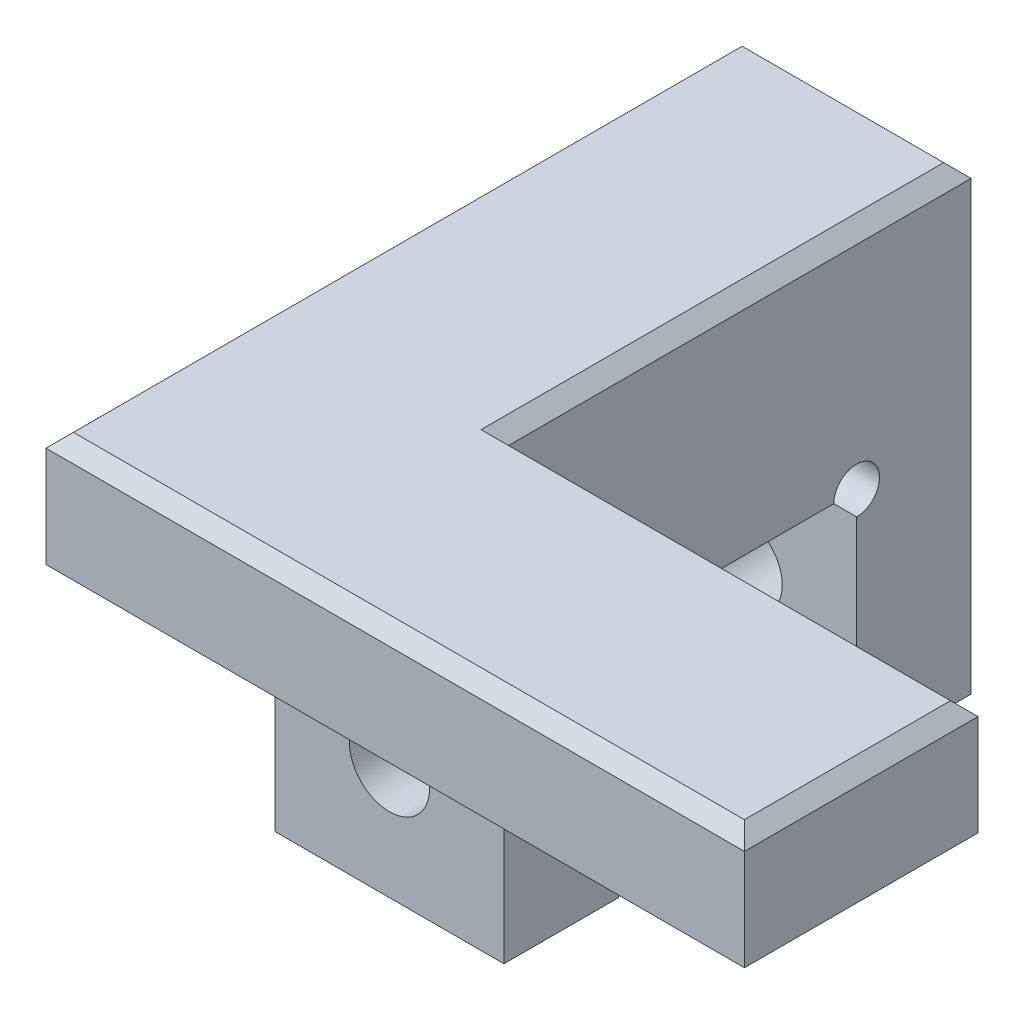
ISO-10303-21;
HEADER;
FILE_DESCRIPTION(('STEP AP214'),'2;1');
FILE_NAME('part.step','',(''),(''),'','','');
FILE_SCHEMA(('AUTOMOTIVE_DESIGN { 1 0 10303 214 1 1 1 1 }'));
ENDSEC;
DATA;
#1=APPLICATION_CONTEXT('core data for automotive mechanical design processes');
#2=APPLICATION_PROTOCOL_DEFINITION('international standard','automotive_design',2000,#1);
#3=PRODUCT_CONTEXT('',#1,'mechanical');
#4=PRODUCT('Part','Part','',(#3));
#5=PRODUCT_RELATED_PRODUCT_CATEGORY('part','',(#4));
#6=PRODUCT_DEFINITION_FORMATION('','',#4);
#7=PRODUCT_DEFINITION_CONTEXT('part definition',#1,'design');
#8=PRODUCT_DEFINITION('design','',#6,#7);
#9=PRODUCT_DEFINITION_SHAPE('','',#8);
#10=(LENGTH_UNIT() NAMED_UNIT(*) SI_UNIT(.MILLI.,.METRE.));
#11=(NAMED_UNIT(*) PLANE_ANGLE_UNIT() SI_UNIT($,.RADIAN.));
#12=(NAMED_UNIT(*) SI_UNIT($,.STERADIAN.) SOLID_ANGLE_UNIT());
#13=UNCERTAINTY_MEASURE_WITH_UNIT(LENGTH_MEASURE(1.E-05),#10,'distance_accuracy_value','');
#14=(GEOMETRIC_REPRESENTATION_CONTEXT(3) GLOBAL_UNCERTAINTY_ASSIGNED_CONTEXT((#13)) GLOBAL_UNIT_ASSIGNED_CONTEXT((#10,
#11,#12)) REPRESENTATION_CONTEXT('',''));
#15=CARTESIAN_POINT('',(0.,0.,0.));
#16=DIRECTION('',(0.,0.,1.));
#17=DIRECTION('',(1.,0.,0.));
#18=AXIS2_PLACEMENT_3D('',#15,#16,#17);
#19=CARTESIAN_POINT('',(10.,0.,5.2));
#20=DIRECTION('',(0.,0.,1.));
#21=DIRECTION('',(1.,0.,0.));
#22=AXIS2_PLACEMENT_3D('',#19,#20,#21);
#23=PLANE('',#22);
#24=CARTESIAN_POINT('',(15.,-0.0999999999999989,5.2));
#25=DIRECTION('',(0.,0.,1.));
#26=DIRECTION('',(1.,0.,0.));
#27=AXIS2_PLACEMENT_3D('',#24,#25,#26);
#28=CIRCLE('',#27,1.75);
#29=CARTESIAN_POINT('',(16.75,-0.0999999999999989,5.2));
#30=VERTEX_POINT('',#29);
#31=EDGE_CURVE('E325',#30,#30,#28,.F.);
#32=ORIENTED_EDGE('',*,*,#31,.F.);
#33=EDGE_LOOP('',(#32));
#34=FACE_BOUND('',#33,.T.);
#35=DIRECTION('',(-1.,0.,0.));
#36=VECTOR('',#35,1.);
#37=CARTESIAN_POINT('',(10.,-5.1,5.2));
#38=LINE('',#37,#36);
#39=CARTESIAN_POINT('',(20.,-5.1,5.2));
#40=VERTEX_POINT('',#39);
#41=CARTESIAN_POINT('',(10.,-5.1,5.2));
#42=VERTEX_POINT('',#41);
#43=EDGE_CURVE('E214',#40,#42,#38,.T.);
#44=ORIENTED_EDGE('',*,*,#43,.T.);
#45=DIRECTION('',(0.,1.,0.));
#46=VECTOR('',#45,1.);
#47=CARTESIAN_POINT('',(10.,0.,5.2));
#48=LINE('',#47,#46);
#49=CARTESIAN_POINT('',(10.,4.1,5.2));
#50=VERTEX_POINT('',#49);
#51=EDGE_CURVE('E387',#42,#50,#48,.T.);
#52=ORIENTED_EDGE('',*,*,#51,.T.);
#53=DIRECTION('',(-1.,0.,0.));
#54=VECTOR('',#53,1.);
#55=CARTESIAN_POINT('',(10.,4.1,5.2));
#56=LINE('',#55,#54);
#57=CARTESIAN_POINT('',(20.,4.1,5.2));
#58=VERTEX_POINT('',#57);
#59=EDGE_CURVE('E197',#50,#58,#56,.F.);
#60=ORIENTED_EDGE('',*,*,#59,.T.);
#61=DIRECTION('',(0.,1.,0.));
#62=VECTOR('',#61,1.);
#63=CARTESIAN_POINT('',(20.,0.,5.2));
#64=LINE('',#63,#62);
#65=EDGE_CURVE('E355',#40,#58,#64,.T.);
#66=ORIENTED_EDGE('',*,*,#65,.F.);
#67=EDGE_LOOP('',(#44,#52,#60,#66));
#68=FACE_BOUND('',#67,.T.);
#69=ADVANCED_FACE('F45',(#34,#68),#23,.F.);
#70=CARTESIAN_POINT('',(10.,5.1,0.));
#71=DIRECTION('',(0.,1.,0.));
#72=DIRECTION('',(0.,0.,1.));
#73=AXIS2_PLACEMENT_3D('',#70,#71,#72);
#74=PLANE('',#73);
#75=DIRECTION('',(-1.,0.,0.));
#76=VECTOR('',#75,1.);
#77=CARTESIAN_POINT('',(10.,5.1,4.2));
#78=LINE('',#77,#76);
#79=CARTESIAN_POINT('',(20.,5.1,4.2));
#80=VERTEX_POINT('',#79);
#81=CARTESIAN_POINT('',(10.,5.1,4.2));
#82=VERTEX_POINT('',#81);
#83=EDGE_CURVE('E203',#80,#82,#78,.T.);
#84=ORIENTED_EDGE('',*,*,#83,.T.);
#85=DIRECTION('',(0.,0.,-1.));
#86=VECTOR('',#85,1.);
#87=CARTESIAN_POINT('',(10.,5.1,0.));
#88=LINE('',#87,#86);
#89=CARTESIAN_POINT('',(10.,5.1,-4.2));
#90=VERTEX_POINT('',#89);
#91=EDGE_CURVE('E374',#82,#90,#88,.T.);
#92=ORIENTED_EDGE('',*,*,#91,.T.);
#93=DIRECTION('',(-1.,0.,0.));
#94=VECTOR('',#93,1.);
#95=CARTESIAN_POINT('',(10.,5.1,-4.2));
#96=LINE('',#95,#94);
#97=CARTESIAN_POINT('',(20.,5.1,-4.2));
#98=VERTEX_POINT('',#97);
#99=EDGE_CURVE('E366',#90,#98,#96,.F.);
#100=ORIENTED_EDGE('',*,*,#99,.T.);
#101=DIRECTION('',(0.,0.,-1.));
#102=VECTOR('',#101,1.);
#103=CARTESIAN_POINT('',(20.,5.1,0.));
#104=LINE('',#103,#102);
#105=EDGE_CURVE('E352',#80,#98,#104,.T.);
#106=ORIENTED_EDGE('',*,*,#105,.F.);
#107=EDGE_LOOP('',(#84,#92,#100,#106));
#108=FACE_BOUND('',#107,.T.);
#109=ADVANCED_FACE('F373',(#108),#74,.F.);
#110=CARTESIAN_POINT('',(10.,0.,-5.2));
#111=DIRECTION('',(0.,0.,1.));
#112=DIRECTION('',(1.,0.,0.));
#113=AXIS2_PLACEMENT_3D('',#110,#111,#112);
#114=PLANE('',#113);
#115=DIRECTION('',(0.,1.,0.));
#116=VECTOR('',#115,1.);
#117=CARTESIAN_POINT('',(10.,0.,-5.2));
#118=LINE('',#117,#116);
#119=CARTESIAN_POINT('',(10.,-5.1,-5.19999999999999));
#120=VERTEX_POINT('',#119);
#121=CARTESIAN_POINT('',(10.,4.1,-5.2));
#122=VERTEX_POINT('',#121);
#123=EDGE_CURVE('E178',#120,#122,#118,.T.);
#124=ORIENTED_EDGE('',*,*,#123,.F.);
#125=DIRECTION('',(-1.,0.,0.));
#126=VECTOR('',#125,1.);
#127=CARTESIAN_POINT('',(10.,-5.1,-5.2));
#128=LINE('',#127,#126);
#129=CARTESIAN_POINT('',(20.,-5.1,-5.2));
#130=VERTEX_POINT('',#129);
#131=EDGE_CURVE('E210',#130,#120,#128,.T.);
#132=ORIENTED_EDGE('',*,*,#131,.F.);
#133=DIRECTION('',(0.,1.,0.));
#134=VECTOR('',#133,1.);
#135=CARTESIAN_POINT('',(20.,0.,-5.2));
#136=LINE('',#135,#134);
#137=CARTESIAN_POINT('',(20.,4.1,-5.2));
#138=VERTEX_POINT('',#137);
#139=EDGE_CURVE('E349',#130,#138,#136,.T.);
#140=ORIENTED_EDGE('',*,*,#139,.T.);
#141=DIRECTION('',(-1.,0.,0.));
#142=VECTOR('',#141,1.);
#143=CARTESIAN_POINT('',(10.,4.1,-5.2));
#144=LINE('',#143,#142);
#145=EDGE_CURVE('E363',#122,#138,#144,.F.);
#146=ORIENTED_EDGE('',*,*,#145,.F.);
#147=EDGE_LOOP('',(#124,#132,#140,#146));
#148=FACE_BOUND('',#147,.T.);
#149=CARTESIAN_POINT('',(15.,-0.0999999999999989,-5.2));
#150=DIRECTION('',(0.,0.,1.));
#151=DIRECTION('',(1.,0.,0.));
#152=AXIS2_PLACEMENT_3D('',#149,#150,#151);
#153=CIRCLE('',#152,1.75);
#154=CARTESIAN_POINT('',(16.75,-0.0999999999999989,-5.2));
#155=VERTEX_POINT('',#154);
#156=EDGE_CURVE('E321',#155,#155,#153,.F.);
#157=ORIENTED_EDGE('',*,*,#156,.T.);
#158=EDGE_LOOP('',(#157));
#159=FACE_BOUND('',#158,.T.);
#160=ADVANCED_FACE('F407',(#148,#159),#114,.T.);
#161=CARTESIAN_POINT('',(10.,0.,10.2));
#162=DIRECTION('',(0.,0.,-1.));
#163=DIRECTION('',(0.,1.,0.));
#164=AXIS2_PLACEMENT_3D('',#161,#162,#163);
#165=PLANE('',#164);
#166=CARTESIAN_POINT('',(15.,-0.0999999999999989,10.2));
#167=DIRECTION('',(0.,0.,-1.));
#168=DIRECTION('',(0.,1.,0.));
#169=AXIS2_PLACEMENT_3D('',#166,#167,#168);
#170=CIRCLE('',#169,1.75);
#171=CARTESIAN_POINT('',(15.,1.65,10.2));
#172=VERTEX_POINT('',#171);
#173=EDGE_CURVE('E329',#172,#172,#170,.F.);
#174=ORIENTED_EDGE('',*,*,#173,.F.);
#175=EDGE_LOOP('',(#174));
#176=FACE_BOUND('',#175,.T.);
#177=DIRECTION('',(-1.,0.,0.));
#178=VECTOR('',#177,1.);
#179=CARTESIAN_POINT('',(10.,10.,10.2));
#180=LINE('',#179,#178);
#181=CARTESIAN_POINT('',(20.,10.,10.2));
#182=VERTEX_POINT('',#181);
#183=CARTESIAN_POINT('',(10.,10.,10.2));
#184=VERTEX_POINT('',#183);
#185=EDGE_CURVE('E196',#182,#184,#180,.T.);
#186=ORIENTED_EDGE('',*,*,#185,.T.);
#187=DIRECTION('',(0.,-1.,0.));
#188=VECTOR('',#187,1.);
#189=CARTESIAN_POINT('',(10.,0.,10.2));
#190=LINE('',#189,#188);
#191=CARTESIAN_POINT('',(10.,-5.1,10.2));
#192=VERTEX_POINT('',#191);
#193=EDGE_CURVE('E173',#184,#192,#190,.T.);
#194=ORIENTED_EDGE('',*,*,#193,.T.);
#195=DIRECTION('',(-1.,0.,0.));
#196=VECTOR('',#195,1.);
#197=CARTESIAN_POINT('',(10.,-5.1,10.2));
#198=LINE('',#197,#196);
#199=CARTESIAN_POINT('',(20.,-5.1,10.2));
#200=VERTEX_POINT('',#199);
#201=EDGE_CURVE('E218',#200,#192,#198,.T.);
#202=ORIENTED_EDGE('',*,*,#201,.F.);
#203=DIRECTION('',(0.,-1.,0.));
#204=VECTOR('',#203,1.);
#205=CARTESIAN_POINT('',(20.,0.,10.2));
#206=LINE('',#205,#204);
#207=EDGE_CURVE('E333',#182,#200,#206,.T.);
#208=ORIENTED_EDGE('',*,*,#207,.F.);
#209=EDGE_LOOP('',(#186,#194,#202,#208));
#210=FACE_BOUND('',#209,.T.);
#211=ADVANCED_FACE('F448',(#176,#210),#165,.F.);
#212=CARTESIAN_POINT('',(10.,-5.1,0.));
#213=DIRECTION('',(0.,1.,0.));
#214=DIRECTION('',(0.,0.,1.));
#215=AXIS2_PLACEMENT_3D('',#212,#213,#214);
#216=PLANE('',#215);
#217=ORIENTED_EDGE('',*,*,#201,.T.);
#218=DIRECTION('',(0.,0.,-1.));
#219=VECTOR('',#218,1.);
#220=CARTESIAN_POINT('',(10.,-5.1,20.2));
#221=LINE('',#220,#219);
#222=EDGE_CURVE('E187',#192,#42,#221,.T.);
#223=ORIENTED_EDGE('',*,*,#222,.T.);
#224=ORIENTED_EDGE('',*,*,#43,.F.);
#225=DIRECTION('',(0.,0.,-1.));
#226=VECTOR('',#225,1.);
#227=CARTESIAN_POINT('',(20.,-5.1,0.));
#228=LINE('',#227,#226);
#229=EDGE_CURVE('E359',#200,#40,#228,.T.);
#230=ORIENTED_EDGE('',*,*,#229,.F.);
#231=EDGE_LOOP('',(#217,#223,#224,#230));
#232=FACE_BOUND('',#231,.T.);
#233=ADVANCED_FACE('F446',(#232),#216,.F.);
#234=CARTESIAN_POINT('',(10.,-5.1,0.));
#235=DIRECTION('',(0.,1.,0.));
#236=DIRECTION('',(0.,0.,1.));
#237=AXIS2_PLACEMENT_3D('',#234,#235,#236);
#238=PLANE('',#237);
#239=ORIENTED_EDGE('',*,*,#131,.T.);
#240=CARTESIAN_POINT('',(10.,-5.1,-10.2));
#241=VERTEX_POINT('',#240);
#242=EDGE_CURVE('E402',#120,#241,#221,.T.);
#243=ORIENTED_EDGE('',*,*,#242,.T.);
#244=DIRECTION('',(-1.,0.,0.));
#245=VECTOR('',#244,1.);
#246=CARTESIAN_POINT('',(10.,-5.1,-10.2));
#247=LINE('',#246,#245);
#248=CARTESIAN_POINT('',(20.,-5.1,-10.2));
#249=VERTEX_POINT('',#248);
#250=EDGE_CURVE('E201',#249,#241,#247,.T.);
#251=ORIENTED_EDGE('',*,*,#250,.F.);
#252=DIRECTION('',(0.,0.,-1.));
#253=VECTOR('',#252,1.);
#254=CARTESIAN_POINT('',(20.,-5.1,0.));
#255=LINE('',#254,#253);
#256=EDGE_CURVE('E345',#130,#249,#255,.T.);
#257=ORIENTED_EDGE('',*,*,#256,.F.);
#258=EDGE_LOOP('',(#239,#243,#251,#257));
#259=FACE_BOUND('',#258,.T.);
#260=ADVANCED_FACE('F411',(#259),#238,.F.);
#261=CARTESIAN_POINT('',(10.,0.,-10.2));
#262=DIRECTION('',(0.,0.,1.));
#263=DIRECTION('',(1.,0.,0.));
#264=AXIS2_PLACEMENT_3D('',#261,#262,#263);
#265=PLANE('',#264);
#266=ORIENTED_EDGE('',*,*,#250,.T.);
#267=DIRECTION('',(0.,1.,0.));
#268=VECTOR('',#267,1.);
#269=CARTESIAN_POINT('',(10.,0.,-10.2));
#270=LINE('',#269,#268);
#271=CARTESIAN_POINT('',(10.,14.4,-10.2));
#272=VERTEX_POINT('',#271);
#273=EDGE_CURVE('E186',#241,#272,#270,.T.);
#274=ORIENTED_EDGE('',*,*,#273,.T.);
#275=DIRECTION('',(1.,0.,0.));
#276=VECTOR('',#275,1.);
#277=CARTESIAN_POINT('',(10.,14.4,-10.2));
#278=LINE('',#277,#276);
#279=CARTESIAN_POINT('',(20.,14.4,-10.2));
#280=VERTEX_POINT('',#279);
#281=EDGE_CURVE('E230',#272,#280,#278,.T.);
#282=ORIENTED_EDGE('',*,*,#281,.T.);
#283=DIRECTION('',(0.,1.,0.));
#284=VECTOR('',#283,1.);
#285=CARTESIAN_POINT('',(20.,0.,-10.2));
#286=LINE('',#285,#284);
#287=EDGE_CURVE('E341',#249,#280,#286,.T.);
#288=ORIENTED_EDGE('',*,*,#287,.F.);
#289=EDGE_LOOP('',(#266,#274,#282,#288));
#290=FACE_BOUND('',#289,.T.);
#291=CARTESIAN_POINT('',(15.,-0.0999999999999989,-10.2));
#292=DIRECTION('',(0.,0.,-1.));
#293=DIRECTION('',(-1.,0.,0.));
#294=AXIS2_PLACEMENT_3D('',#291,#292,#293);
#295=CIRCLE('',#294,1.75);
#296=CARTESIAN_POINT('',(13.25,-0.0999999999999989,-10.2));
#297=VERTEX_POINT('',#296);
#298=EDGE_CURVE('E317',#297,#297,#295,.T.);
#299=ORIENTED_EDGE('',*,*,#298,.F.);
#300=EDGE_LOOP('',(#299));
#301=FACE_BOUND('',#300,.T.);
#302=ADVANCED_FACE('F415',(#290,#301),#265,.F.);
#303=CARTESIAN_POINT('',(10.,15.,20.2));
#304=DIRECTION('',(0.,0.,-1.));
#305=DIRECTION('',(0.,1.,0.));
#306=AXIS2_PLACEMENT_3D('',#303,#304,#305);
#307=PLANE('',#306);
#308=DIRECTION('',(-1.,0.,0.));
#309=VECTOR('',#308,1.);
#310=CARTESIAN_POINT('',(10.,14.4,20.2));
#311=LINE('',#310,#309);
#312=CARTESIAN_POINT('',(40.5,14.4,20.2));
#313=VERTEX_POINT('',#312);
#314=CARTESIAN_POINT('',(10.,14.4,20.2));
#315=VERTEX_POINT('',#314);
#316=EDGE_CURVE('E11',#313,#315,#311,.T.);
#317=ORIENTED_EDGE('',*,*,#316,.T.);
#318=DIRECTION('',(0.,1.,0.));
#319=VECTOR('',#318,1.);
#320=CARTESIAN_POINT('',(10.,-5.1,20.2));
#321=LINE('',#320,#319);
#322=CARTESIAN_POINT('',(10.,9.99999999999999,20.2));
#323=VERTEX_POINT('',#322);
#324=EDGE_CURVE('E171',#323,#315,#321,.T.);
#325=ORIENTED_EDGE('',*,*,#324,.F.);
#326=DIRECTION('',(1.,0.,0.));
#327=VECTOR('',#326,1.);
#328=CARTESIAN_POINT('',(10.,9.99999999999999,20.2));
#329=LINE('',#328,#327);
#330=CARTESIAN_POINT('',(40.5,9.99999999999999,20.2));
#331=VERTEX_POINT('',#330);
#332=EDGE_CURVE('E182',#323,#331,#329,.T.);
#333=ORIENTED_EDGE('',*,*,#332,.T.);
#334=DIRECTION('',(0.,-1.,0.));
#335=VECTOR('',#334,1.);
#336=CARTESIAN_POINT('',(40.5,15.,20.2));
#337=LINE('',#336,#335);
#338=EDGE_CURVE('E314',#313,#331,#337,.T.);
#339=ORIENTED_EDGE('',*,*,#338,.F.);
#340=EDGE_LOOP('',(#317,#325,#333,#339));
#341=FACE_BOUND('',#340,.T.);
#342=ADVANCED_FACE('F181',(#341),#307,.F.);
#343=CARTESIAN_POINT('',(0.,10.,0.));
#344=DIRECTION('',(0.,-1.,0.));
#345=DIRECTION('',(0.,0.,-1.));
#346=AXIS2_PLACEMENT_3D('',#343,#344,#345);
#347=PLANE('',#346);
#348=DIRECTION('',(0.,0.,1.));
#349=VECTOR('',#348,1.);
#350=CARTESIAN_POINT('',(10.,10.,0.));
#351=LINE('',#350,#349);
#352=EDGE_CURVE('E168',#184,#323,#351,.T.);
#353=ORIENTED_EDGE('',*,*,#352,.F.);
#354=ORIENTED_EDGE('',*,*,#185,.F.);
#355=DIRECTION('',(0.,0.,1.));
#356=VECTOR('',#355,1.);
#357=CARTESIAN_POINT('',(20.,10.,0.));
#358=LINE('',#357,#356);
#359=CARTESIAN_POINT('',(20.,10.,10.));
#360=VERTEX_POINT('',#359);
#361=EDGE_CURVE('E337',#360,#182,#358,.T.);
#362=ORIENTED_EDGE('',*,*,#361,.F.);
#363=DIRECTION('',(1.,0.,0.));
#364=VECTOR('',#363,1.);
#365=CARTESIAN_POINT('',(40.5,10.,10.));
#366=LINE('',#365,#364);
#367=CARTESIAN_POINT('',(40.5,10.,10.));
#368=VERTEX_POINT('',#367);
#369=EDGE_CURVE('E305',#360,#368,#366,.T.);
#370=ORIENTED_EDGE('',*,*,#369,.T.);
#371=DIRECTION('',(0.,0.,1.));
#372=VECTOR('',#371,1.);
#373=CARTESIAN_POINT('',(40.5,9.99999999999999,20.2));
#374=LINE('',#373,#372);
#375=EDGE_CURVE('E194',#368,#331,#374,.T.);
#376=ORIENTED_EDGE('',*,*,#375,.T.);
#377=ORIENTED_EDGE('',*,*,#332,.F.);
#378=EDGE_LOOP('',(#353,#354,#362,#370,#376,#377));
#379=FACE_BOUND('',#378,.T.);
#380=CARTESIAN_POINT('',(30.25,10.,15.1));
#381=DIRECTION('',(0.,1.,0.));
#382=DIRECTION('',(0.,0.,-1.));
#383=AXIS2_PLACEMENT_3D('',#380,#381,#382);
#384=CIRCLE('',#383,3.2);
#385=CARTESIAN_POINT('',(30.25,10.,11.9));
#386=VERTEX_POINT('',#385);
#387=EDGE_CURVE('E287',#386,#386,#384,.T.);
#388=ORIENTED_EDGE('',*,*,#387,.T.);
#389=EDGE_LOOP('',(#388));
#390=FACE_BOUND('',#389,.T.);
#391=ADVANCED_FACE('F190',(#379,#390),#347,.T.);
#392=CARTESIAN_POINT('',(10.,5.1,-5.2));
#393=DIRECTION('',(-1.,0.,0.));
#394=DIRECTION('',(0.,0.,1.));
#395=AXIS2_PLACEMENT_3D('',#392,#393,#394);
#396=CYLINDRICAL_SURFACE('',#395,1.);
#397=ORIENTED_EDGE('',*,*,#99,.F.);
#398=CARTESIAN_POINT('',(10.,5.1,-5.2));
#399=DIRECTION('',(1.,0.,0.));
#400=DIRECTION('',(0.,1.,0.));
#401=AXIS2_PLACEMENT_3D('',#398,#399,#400);
#402=CIRCLE('',#401,1.);
#403=EDGE_CURVE('E390',#90,#122,#402,.F.);
#404=ORIENTED_EDGE('',*,*,#403,.T.);
#405=ORIENTED_EDGE('',*,*,#145,.T.);
#406=CARTESIAN_POINT('',(20.,5.1,-5.2));
#407=DIRECTION('',(-1.,0.,0.));
#408=DIRECTION('',(0.,0.,1.));
#409=AXIS2_PLACEMENT_3D('',#406,#407,#408);
#410=CIRCLE('',#409,1.);
#411=EDGE_CURVE('E281',#98,#138,#410,.T.);
#412=ORIENTED_EDGE('',*,*,#411,.F.);
#413=EDGE_LOOP('',(#397,#404,#405,#412));
#414=FACE_BOUND('',#413,.T.);
#415=ADVANCED_FACE('F406',(#414),#396,.F.);
#416=CARTESIAN_POINT('',(10.,5.1,5.2));
#417=DIRECTION('',(-1.,0.,0.));
#418=DIRECTION('',(0.,0.,1.));
#419=AXIS2_PLACEMENT_3D('',#416,#417,#418);
#420=CYLINDRICAL_SURFACE('',#419,1.);
#421=ORIENTED_EDGE('',*,*,#59,.F.);
#422=CARTESIAN_POINT('',(10.,5.1,5.2));
#423=DIRECTION('',(1.,0.,0.));
#424=DIRECTION('',(0.,1.,0.));
#425=AXIS2_PLACEMENT_3D('',#422,#423,#424);
#426=CIRCLE('',#425,1.);
#427=EDGE_CURVE('E381',#50,#82,#426,.F.);
#428=ORIENTED_EDGE('',*,*,#427,.T.);
#429=ORIENTED_EDGE('',*,*,#83,.F.);
#430=CARTESIAN_POINT('',(20.,5.1,5.2));
#431=DIRECTION('',(-1.,0.,0.));
#432=DIRECTION('',(0.,0.,1.));
#433=AXIS2_PLACEMENT_3D('',#430,#431,#432);
#434=CIRCLE('',#433,1.);
#435=EDGE_CURVE('E226',#80,#58,#434,.F.);
#436=ORIENTED_EDGE('',*,*,#435,.T.);
#437=EDGE_LOOP('',(#421,#428,#429,#436));
#438=FACE_BOUND('',#437,.T.);
#439=ADVANCED_FACE('F380',(#438),#420,.F.);
#440=CARTESIAN_POINT('',(20.,0.,0.));
#441=DIRECTION('',(-1.,0.,0.));
#442=DIRECTION('',(0.,0.,-1.));
#443=AXIS2_PLACEMENT_3D('',#440,#441,#442);
#444=PLANE('',#443);
#445=ORIENTED_EDGE('',*,*,#287,.T.);
#446=DIRECTION('',(0.,0.,1.));
#447=VECTOR('',#446,1.);
#448=CARTESIAN_POINT('',(20.,14.4,0.));
#449=LINE('',#448,#447);
#450=CARTESIAN_POINT('',(20.,14.4,10.));
#451=VERTEX_POINT('',#450);
#452=EDGE_CURVE('E253',#280,#451,#449,.T.);
#453=ORIENTED_EDGE('',*,*,#452,.T.);
#454=DIRECTION('',(0.,-1.,0.));
#455=VECTOR('',#454,1.);
#456=CARTESIAN_POINT('',(20.,15.,10.));
#457=LINE('',#456,#455);
#458=EDGE_CURVE('E308',#451,#360,#457,.T.);
#459=ORIENTED_EDGE('',*,*,#458,.T.);
#460=ORIENTED_EDGE('',*,*,#361,.T.);
#461=ORIENTED_EDGE('',*,*,#207,.T.);
#462=ORIENTED_EDGE('',*,*,#229,.T.);
#463=ORIENTED_EDGE('',*,*,#65,.T.);
#464=ORIENTED_EDGE('',*,*,#435,.F.);
#465=ORIENTED_EDGE('',*,*,#105,.T.);
#466=ORIENTED_EDGE('',*,*,#411,.T.);
#467=ORIENTED_EDGE('',*,*,#139,.F.);
#468=ORIENTED_EDGE('',*,*,#256,.T.);
#469=EDGE_LOOP('',(#445,#453,#459,#460,#461,#462,#463,#464,#465,#466,#467,#468));
#470=FACE_BOUND('',#469,.T.);
#471=ADVANCED_FACE('F382',(#470),#444,.F.);
#472=CARTESIAN_POINT('',(15.,-0.0999999999999989,-10.2));
#473=DIRECTION('',(0.,0.,1.));
#474=DIRECTION('',(1.,0.,0.));
#475=AXIS2_PLACEMENT_3D('',#472,#473,#474);
#476=CYLINDRICAL_SURFACE('',#475,1.75);
#477=ORIENTED_EDGE('',*,*,#156,.F.);
#478=EDGE_LOOP('',(#477));
#479=FACE_BOUND('',#478,.T.);
#480=ORIENTED_EDGE('',*,*,#298,.T.);
#481=EDGE_LOOP('',(#480));
#482=FACE_BOUND('',#481,.T.);
#483=ADVANCED_FACE('F485',(#479,#482),#476,.F.);
#484=ORIENTED_EDGE('',*,*,#31,.T.);
#485=EDGE_LOOP('',(#484));
#486=FACE_BOUND('',#485,.T.);
#487=ORIENTED_EDGE('',*,*,#173,.T.);
#488=EDGE_LOOP('',(#487));
#489=FACE_BOUND('',#488,.T.);
#490=ADVANCED_FACE('F488',(#486,#489),#476,.F.);
#491=CARTESIAN_POINT('',(40.5,15.,20.2));
#492=DIRECTION('',(1.,0.,0.));
#493=DIRECTION('',(0.,0.,-1.));
#494=AXIS2_PLACEMENT_3D('',#491,#492,#493);
#495=PLANE('',#494);
#496=DIRECTION('',(0.,-1.,0.));
#497=VECTOR('',#496,1.);
#498=CARTESIAN_POINT('',(40.5,15.,10.));
#499=LINE('',#498,#497);
#500=CARTESIAN_POINT('',(40.5,14.4,10.));
#501=VERTEX_POINT('',#500);
#502=EDGE_CURVE('E311',#501,#368,#499,.T.);
#503=ORIENTED_EDGE('',*,*,#502,.F.);
#504=DIRECTION('',(0.,0.,1.));
#505=VECTOR('',#504,1.);
#506=CARTESIAN_POINT('',(40.5,14.4,20.2));
#507=LINE('',#506,#505);
#508=EDGE_CURVE('E56',#501,#313,#507,.T.);
#509=ORIENTED_EDGE('',*,*,#508,.T.);
#510=ORIENTED_EDGE('',*,*,#338,.T.);
#511=ORIENTED_EDGE('',*,*,#375,.F.);
#512=EDGE_LOOP('',(#503,#509,#510,#511));
#513=FACE_BOUND('',#512,.T.);
#514=ADVANCED_FACE('F490',(#513),#495,.T.);
#515=CARTESIAN_POINT('',(40.5,15.,10.));
#516=DIRECTION('',(0.,0.,-1.));
#517=DIRECTION('',(0.,1.,0.));
#518=AXIS2_PLACEMENT_3D('',#515,#516,#517);
#519=PLANE('',#518);
#520=ORIENTED_EDGE('',*,*,#458,.F.);
#521=DIRECTION('',(1.,0.,0.));
#522=VECTOR('',#521,1.);
#523=CARTESIAN_POINT('',(40.5,14.4,10.));
#524=LINE('',#523,#522);
#525=EDGE_CURVE('E71',#451,#501,#524,.T.);
#526=ORIENTED_EDGE('',*,*,#525,.T.);
#527=ORIENTED_EDGE('',*,*,#502,.T.);
#528=ORIENTED_EDGE('',*,*,#369,.F.);
#529=EDGE_LOOP('',(#520,#526,#527,#528));
#530=FACE_BOUND('',#529,.T.);
#531=ADVANCED_FACE('F423',(#530),#519,.T.);
#532=CARTESIAN_POINT('',(20.,15.,0.));
#533=DIRECTION('',(0.,-1.,0.));
#534=DIRECTION('',(0.,0.,-1.));
#535=AXIS2_PLACEMENT_3D('',#532,#533,#534);
#536=PLANE('',#535);
#537=DIRECTION('',(0.,0.,-1.));
#538=VECTOR('',#537,1.);
#539=CARTESIAN_POINT('',(19.4,15.,0.));
#540=LINE('',#539,#538);
#541=CARTESIAN_POINT('',(19.4,15.,10.6));
#542=VERTEX_POINT('',#541);
#543=CARTESIAN_POINT('',(19.4,15.,-9.60000000000001));
#544=VERTEX_POINT('',#543);
#545=EDGE_CURVE('E246',#542,#544,#540,.T.);
#546=ORIENTED_EDGE('',*,*,#545,.T.);
#547=DIRECTION('',(-1.,0.,0.));
#548=VECTOR('',#547,1.);
#549=CARTESIAN_POINT('',(20.,15.,-9.60000000000001));
#550=LINE('',#549,#548);
#551=CARTESIAN_POINT('',(10.6,15.,-9.60000000000001));
#552=VERTEX_POINT('',#551);
#553=EDGE_CURVE('E249',#544,#552,#550,.T.);
#554=ORIENTED_EDGE('',*,*,#553,.T.);
#555=DIRECTION('',(0.,0.,1.));
#556=VECTOR('',#555,1.);
#557=CARTESIAN_POINT('',(10.6,15.,20.2));
#558=LINE('',#557,#556);
#559=CARTESIAN_POINT('',(10.6,15.,19.6));
#560=VERTEX_POINT('',#559);
#561=EDGE_CURVE('E234',#552,#560,#558,.T.);
#562=ORIENTED_EDGE('',*,*,#561,.T.);
#563=DIRECTION('',(1.,0.,0.));
#564=VECTOR('',#563,1.);
#565=CARTESIAN_POINT('',(20.,15.,19.6));
#566=LINE('',#565,#564);
#567=CARTESIAN_POINT('',(39.9,15.,19.6));
#568=VERTEX_POINT('',#567);
#569=EDGE_CURVE('E237',#560,#568,#566,.T.);
#570=ORIENTED_EDGE('',*,*,#569,.T.);
#571=DIRECTION('',(0.,0.,-1.));
#572=VECTOR('',#571,1.);
#573=CARTESIAN_POINT('',(39.9,15.,10.));
#574=LINE('',#573,#572);
#575=CARTESIAN_POINT('',(39.9,15.,10.6));
#576=VERTEX_POINT('',#575);
#577=EDGE_CURVE('E240',#568,#576,#574,.T.);
#578=ORIENTED_EDGE('',*,*,#577,.T.);
#579=DIRECTION('',(-1.,0.,0.));
#580=VECTOR('',#579,1.);
#581=CARTESIAN_POINT('',(20.,15.,10.6));
#582=LINE('',#581,#580);
#583=EDGE_CURVE('E243',#576,#542,#582,.T.);
#584=ORIENTED_EDGE('',*,*,#583,.T.);
#585=EDGE_LOOP('',(#546,#554,#562,#570,#578,#584));
#586=FACE_BOUND('',#585,.T.);
#587=ADVANCED_FACE('F430',(#586),#536,.F.);
#588=CARTESIAN_POINT('',(30.25,12.6,15.1));
#589=DIRECTION('',(0.,-1.,0.));
#590=DIRECTION('',(0.,0.,-1.));
#591=AXIS2_PLACEMENT_3D('',#588,#589,#590);
#592=CYLINDRICAL_SURFACE('',#591,3.2);
#593=CARTESIAN_POINT('',(30.25,12.6,15.1));
#594=DIRECTION('',(0.,1.,0.));
#595=DIRECTION('',(0.,0.,-1.));
#596=AXIS2_PLACEMENT_3D('',#593,#594,#595);
#597=CIRCLE('',#596,3.2);
#598=CARTESIAN_POINT('',(30.25,12.6,11.9));
#599=VERTEX_POINT('',#598);
#600=EDGE_CURVE('E296',#599,#599,#597,.T.);
#601=ORIENTED_EDGE('',*,*,#600,.T.);
#602=EDGE_LOOP('',(#601));
#603=FACE_BOUND('',#602,.T.);
#604=ORIENTED_EDGE('',*,*,#387,.F.);
#605=EDGE_LOOP('',(#604));
#606=FACE_BOUND('',#605,.T.);
#607=ADVANCED_FACE('F497',(#603,#606),#592,.F.);
#608=CARTESIAN_POINT('',(30.25,12.6,15.1));
#609=DIRECTION('',(0.,-1.,0.));
#610=DIRECTION('',(0.,0.,-1.));
#611=AXIS2_PLACEMENT_3D('',#608,#609,#610);
#612=PLANE('',#611);
#613=ORIENTED_EDGE('',*,*,#600,.F.);
#614=EDGE_LOOP('',(#613));
#615=FACE_BOUND('',#614,.T.);
#616=ADVANCED_FACE('F500',(#615),#612,.T.);
#617=CARTESIAN_POINT('',(40.5,14.4,20.2));
#618=DIRECTION('',(0.707106781186556,0.707106781186539,0.));
#619=DIRECTION('',(0.,0.,-1.));
#620=AXIS2_PLACEMENT_3D('',#617,#618,#619);
#621=PLANE('',#620);
#622=DIRECTION('',(-0.577350269189621,0.577350269189635,0.577350269189621));
#623=VECTOR('',#622,1.);
#624=CARTESIAN_POINT('',(37.1000000000001,17.8,13.3999999999999));
#625=LINE('',#624,#623);
#626=EDGE_CURVE('E273',#576,#501,#625,.F.);
#627=ORIENTED_EDGE('',*,*,#626,.F.);
#628=ORIENTED_EDGE('',*,*,#577,.F.);
#629=DIRECTION('',(0.577350269189621,-0.577350269189634,0.577350269189623));
#630=VECTOR('',#629,1.);
#631=CARTESIAN_POINT('',(30.3333333333335,24.5666666666667,10.0333333333335));
#632=LINE('',#631,#630);
#633=EDGE_CURVE('E50',#313,#568,#632,.F.);
#634=ORIENTED_EDGE('',*,*,#633,.F.);
#635=ORIENTED_EDGE('',*,*,#508,.F.);
#636=EDGE_LOOP('',(#627,#628,#634,#635));
#637=FACE_BOUND('',#636,.T.);
#638=ADVANCED_FACE('F48',(#637),#621,.T.);
#639=CARTESIAN_POINT('',(10.,14.4,20.2));
#640=DIRECTION('',(0.,-0.707106781186541,-0.707106781186554));
#641=DIRECTION('',(-1.,0.,0.));
#642=AXIS2_PLACEMENT_3D('',#639,#640,#641);
#643=PLANE('',#642);
#644=ORIENTED_EDGE('',*,*,#633,.T.);
#645=ORIENTED_EDGE('',*,*,#569,.F.);
#646=DIRECTION('',(-0.577350269189622,-0.577350269189633,0.577350269189622));
#647=VECTOR('',#646,1.);
#648=CARTESIAN_POINT('',(13.3333333333333,17.7333333333334,16.8666666666667));
#649=LINE('',#648,#647);
#650=EDGE_CURVE('E270',#315,#560,#649,.F.);
#651=ORIENTED_EDGE('',*,*,#650,.F.);
#652=ORIENTED_EDGE('',*,*,#316,.F.);
#653=EDGE_LOOP('',(#644,#645,#651,#652));
#654=FACE_BOUND('',#653,.T.);
#655=ADVANCED_FACE('F438',(#654),#643,.F.);
#656=CARTESIAN_POINT('',(40.5,14.4,10.));
#657=DIRECTION('',(0.,0.707106781186539,-0.707106781186556));
#658=DIRECTION('',(-1.,0.,0.));
#659=AXIS2_PLACEMENT_3D('',#656,#657,#658);
#660=PLANE('',#659);
#661=ORIENTED_EDGE('',*,*,#626,.T.);
#662=ORIENTED_EDGE('',*,*,#525,.F.);
#663=DIRECTION('',(0.577350269189621,-0.577350269189635,-0.577350269189621));
#664=VECTOR('',#663,1.);
#665=CARTESIAN_POINT('',(23.3333333333333,11.0666666666666,6.66666666666672));
#666=LINE('',#665,#664);
#667=EDGE_CURVE('E266',#542,#451,#666,.T.);
#668=ORIENTED_EDGE('',*,*,#667,.F.);
#669=ORIENTED_EDGE('',*,*,#583,.F.);
#670=EDGE_LOOP('',(#661,#662,#668,#669));
#671=FACE_BOUND('',#670,.T.);
#672=ADVANCED_FACE('F425',(#671),#660,.T.);
#673=CARTESIAN_POINT('',(10.,14.4,10.2));
#674=DIRECTION('',(-0.707106781186555,0.70710678118654,0.));
#675=DIRECTION('',(0.,0.,1.));
#676=AXIS2_PLACEMENT_3D('',#673,#674,#675);
#677=PLANE('',#676);
#678=ORIENTED_EDGE('',*,*,#650,.T.);
#679=ORIENTED_EDGE('',*,*,#561,.F.);
#680=DIRECTION('',(0.577350269189623,0.577350269189634,0.577350269189621));
#681=VECTOR('',#680,1.);
#682=CARTESIAN_POINT('',(16.7999999999999,21.2,-3.40000000000012));
#683=LINE('',#682,#681);
#684=EDGE_CURVE('E263',#272,#552,#683,.T.);
#685=ORIENTED_EDGE('',*,*,#684,.F.);
#686=DIRECTION('',(0.,0.,1.));
#687=VECTOR('',#686,1.);
#688=CARTESIAN_POINT('',(10.,14.4,20.2));
#689=LINE('',#688,#687);
#690=EDGE_CURVE('E222',#272,#315,#689,.T.);
#691=ORIENTED_EDGE('',*,*,#690,.T.);
#692=EDGE_LOOP('',(#678,#679,#685,#691));
#693=FACE_BOUND('',#692,.T.);
#694=ADVANCED_FACE('F436',(#693),#677,.T.);
#695=CARTESIAN_POINT('',(20.,14.4,0.));
#696=DIRECTION('',(-0.707106781186556,-0.707106781186539,0.));
#697=DIRECTION('',(0.,0.,1.));
#698=AXIS2_PLACEMENT_3D('',#695,#696,#697);
#699=PLANE('',#698);
#700=ORIENTED_EDGE('',*,*,#667,.T.);
#701=ORIENTED_EDGE('',*,*,#452,.F.);
#702=DIRECTION('',(-0.577350269189621,0.577350269189635,0.577350269189621));
#703=VECTOR('',#702,1.);
#704=CARTESIAN_POINT('',(16.6000000000001,17.8,-6.80000000000005));
#705=LINE('',#704,#703);
#706=EDGE_CURVE('E260',#544,#280,#705,.F.);
#707=ORIENTED_EDGE('',*,*,#706,.F.);
#708=ORIENTED_EDGE('',*,*,#545,.F.);
#709=EDGE_LOOP('',(#700,#701,#707,#708));
#710=FACE_BOUND('',#709,.T.);
#711=ADVANCED_FACE('F427',(#710),#699,.F.);
#712=CARTESIAN_POINT('',(10.,14.4,-10.2));
#713=DIRECTION('',(0.,-0.707106781186539,0.707106781186556));
#714=DIRECTION('',(1.,0.,0.));
#715=AXIS2_PLACEMENT_3D('',#712,#713,#714);
#716=PLANE('',#715);
#717=ORIENTED_EDGE('',*,*,#684,.T.);
#718=ORIENTED_EDGE('',*,*,#553,.F.);
#719=ORIENTED_EDGE('',*,*,#706,.T.);
#720=ORIENTED_EDGE('',*,*,#281,.F.);
#721=EDGE_LOOP('',(#717,#718,#719,#720));
#722=FACE_BOUND('',#721,.T.);
#723=ADVANCED_FACE('F432',(#722),#716,.F.);
#724=CARTESIAN_POINT('',(10.,-5.1,20.2));
#725=DIRECTION('',(1.,0.,0.));
#726=DIRECTION('',(0.,1.,0.));
#727=AXIS2_PLACEMENT_3D('',#724,#725,#726);
#728=PLANE('',#727);
#729=ORIENTED_EDGE('',*,*,#352,.T.);
#730=ORIENTED_EDGE('',*,*,#324,.T.);
#731=ORIENTED_EDGE('',*,*,#690,.F.);
#732=ORIENTED_EDGE('',*,*,#273,.F.);
#733=ORIENTED_EDGE('',*,*,#242,.F.);
#734=ORIENTED_EDGE('',*,*,#123,.T.);
#735=ORIENTED_EDGE('',*,*,#403,.F.);
#736=ORIENTED_EDGE('',*,*,#91,.F.);
#737=ORIENTED_EDGE('',*,*,#427,.F.);
#738=ORIENTED_EDGE('',*,*,#51,.F.);
#739=ORIENTED_EDGE('',*,*,#222,.F.);
#740=ORIENTED_EDGE('',*,*,#193,.F.);
#741=EDGE_LOOP('',(#729,#730,#731,#732,#733,#734,#735,#736,#737,#738,#739,#740));
#742=FACE_BOUND('',#741,.T.);
#743=ADVANCED_FACE('F170',(#742),#728,.F.);
#744=CLOSED_SHELL('',(#69,#109,#160,#211,#233,#260,#302,#342,#391,#415,#439,#471,#483,#490,#514,
#531,#587,#607,#616,#638,#655,#672,#694,#711,#723,#743));
#745=MANIFOLD_SOLID_BREP('B2',#744);
#746=ADVANCED_BREP_SHAPE_REPRESENTATION('',(#18,#745),#14);
#747=SHAPE_DEFINITION_REPRESENTATION(#9,#746);
ENDSEC;
END-ISO-10303-21;
